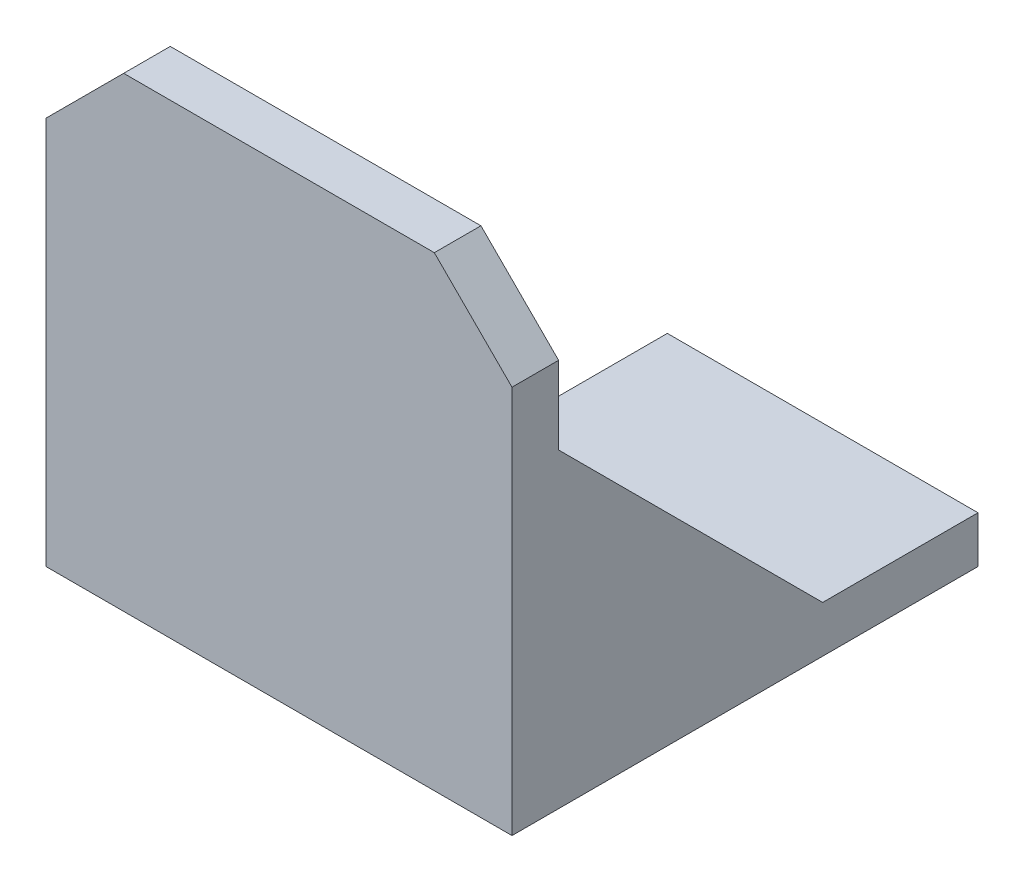
ISO-10303-21;
HEADER;
FILE_DESCRIPTION(('STEP AP214'),'2;1');
FILE_NAME('part.step','',(''),(''),'','','');
FILE_SCHEMA(('AUTOMOTIVE_DESIGN { 1 0 10303 214 1 1 1 1 }'));
ENDSEC;
DATA;
#1=APPLICATION_CONTEXT('core data for automotive mechanical design processes');
#2=APPLICATION_PROTOCOL_DEFINITION('international standard','automotive_design',2000,#1);
#3=PRODUCT_CONTEXT('',#1,'mechanical');
#4=PRODUCT('Part','Part','',(#3));
#5=PRODUCT_RELATED_PRODUCT_CATEGORY('part','',(#4));
#6=PRODUCT_DEFINITION_FORMATION('','',#4);
#7=PRODUCT_DEFINITION_CONTEXT('part definition',#1,'design');
#8=PRODUCT_DEFINITION('design','',#6,#7);
#9=PRODUCT_DEFINITION_SHAPE('','',#8);
#10=(LENGTH_UNIT() NAMED_UNIT(*) SI_UNIT(.MILLI.,.METRE.));
#11=(NAMED_UNIT(*) PLANE_ANGLE_UNIT() SI_UNIT($,.RADIAN.));
#12=(NAMED_UNIT(*) SI_UNIT($,.STERADIAN.) SOLID_ANGLE_UNIT());
#13=UNCERTAINTY_MEASURE_WITH_UNIT(LENGTH_MEASURE(1.E-05),#10,'distance_accuracy_value','');
#14=(GEOMETRIC_REPRESENTATION_CONTEXT(3) GLOBAL_UNCERTAINTY_ASSIGNED_CONTEXT((#13)) GLOBAL_UNIT_ASSIGNED_CONTEXT((#10,
#11,#12)) REPRESENTATION_CONTEXT('',''));
#15=CARTESIAN_POINT('',(0.,0.,0.));
#16=DIRECTION('',(0.,0.,1.));
#17=DIRECTION('',(1.,0.,0.));
#18=AXIS2_PLACEMENT_3D('',#15,#16,#17);
#19=CARTESIAN_POINT('',(0.,3.,0.));
#20=DIRECTION('',(0.,1.,0.));
#21=DIRECTION('',(0.,0.,1.));
#22=AXIS2_PLACEMENT_3D('',#19,#20,#21);
#23=PLANE('',#22);
#24=DIRECTION('',(0.,0.,1.));
#25=VECTOR('',#24,1.);
#26=CARTESIAN_POINT('',(-13.,3.,12.));
#27=LINE('',#26,#25);
#28=CARTESIAN_POINT('',(-13.,3.,-5.));
#29=VERTEX_POINT('',#28);
#30=CARTESIAN_POINT('',(-13.,3.,9.00000000000001));
#31=VERTEX_POINT('',#30);
#32=EDGE_CURVE('E145',#29,#31,#27,.T.);
#33=ORIENTED_EDGE('',*,*,#32,.T.);
#34=DIRECTION('',(-1.,0.,0.));
#35=VECTOR('',#34,1.);
#36=CARTESIAN_POINT('',(0.,3.,9.00000000000001));
#37=LINE('',#36,#35);
#38=CARTESIAN_POINT('',(13.,3.,9.00000000000001));
#39=VERTEX_POINT('',#38);
#40=EDGE_CURVE('E41',#31,#39,#37,.F.);
#41=ORIENTED_EDGE('',*,*,#40,.T.);
#42=DIRECTION('',(0.,0.,-1.));
#43=VECTOR('',#42,1.);
#44=CARTESIAN_POINT('',(13.,3.,-5.));
#45=LINE('',#44,#43);
#46=CARTESIAN_POINT('',(13.,3.,-5.));
#47=VERTEX_POINT('',#46);
#48=EDGE_CURVE('E265',#39,#47,#45,.T.);
#49=ORIENTED_EDGE('',*,*,#48,.T.);
#50=DIRECTION('',(1.,0.,0.));
#51=VECTOR('',#50,1.);
#52=CARTESIAN_POINT('',(13.,3.,-5.));
#53=LINE('',#52,#51);
#54=CARTESIAN_POINT('',(15.,3.,-5.));
#55=VERTEX_POINT('',#54);
#56=EDGE_CURVE('E272',#47,#55,#53,.T.);
#57=ORIENTED_EDGE('',*,*,#56,.T.);
#58=DIRECTION('',(0.,0.,-1.));
#59=VECTOR('',#58,1.);
#60=CARTESIAN_POINT('',(15.,3.,-15.));
#61=LINE('',#60,#59);
#62=CARTESIAN_POINT('',(15.,3.,-15.));
#63=VERTEX_POINT('',#62);
#64=EDGE_CURVE('E174',#55,#63,#61,.T.);
#65=ORIENTED_EDGE('',*,*,#64,.T.);
#66=DIRECTION('',(-1.,0.,0.));
#67=VECTOR('',#66,1.);
#68=CARTESIAN_POINT('',(-4.99999999999999,3.,-15.));
#69=LINE('',#68,#67);
#70=CARTESIAN_POINT('',(-4.99999999999999,3.,-15.));
#71=VERTEX_POINT('',#70);
#72=EDGE_CURVE('E176',#63,#71,#69,.T.);
#73=ORIENTED_EDGE('',*,*,#72,.T.);
#74=DIRECTION('',(0.,0.,1.));
#75=VECTOR('',#74,1.);
#76=CARTESIAN_POINT('',(-4.99999999999999,3.,-15.));
#77=LINE('',#76,#75);
#78=CARTESIAN_POINT('',(-4.99999999999999,3.,-5.));
#79=VERTEX_POINT('',#78);
#80=EDGE_CURVE('E179',#71,#79,#77,.T.);
#81=ORIENTED_EDGE('',*,*,#80,.T.);
#82=DIRECTION('',(-1.,0.,0.));
#83=VECTOR('',#82,1.);
#84=CARTESIAN_POINT('',(-15.,3.,-5.));
#85=LINE('',#84,#83);
#86=EDGE_CURVE('E181',#79,#29,#85,.T.);
#87=ORIENTED_EDGE('',*,*,#86,.T.);
#88=EDGE_LOOP('',(#33,#41,#49,#57,#65,#73,#81,#87));
#89=FACE_BOUND('',#88,.T.);
#90=ADVANCED_FACE('F33',(#89),#23,.T.);
#91=CARTESIAN_POINT('',(15.,3.,-15.));
#92=DIRECTION('',(-1.,0.,0.));
#93=DIRECTION('',(0.,0.,1.));
#94=AXIS2_PLACEMENT_3D('',#91,#92,#93);
#95=PLANE('',#94);
#96=DIRECTION('',(0.,-1.,0.));
#97=VECTOR('',#96,1.);
#98=CARTESIAN_POINT('',(15.,30.,12.));
#99=LINE('',#98,#97);
#100=CARTESIAN_POINT('',(15.,25.,12.));
#101=VERTEX_POINT('',#100);
#102=CARTESIAN_POINT('',(15.,20.0000000000001,12.));
#103=VERTEX_POINT('',#102);
#104=EDGE_CURVE('E171',#101,#103,#99,.T.);
#105=ORIENTED_EDGE('',*,*,#104,.F.);
#106=DIRECTION('',(0.,0.,1.));
#107=VECTOR('',#106,1.);
#108=CARTESIAN_POINT('',(15.,25.,-15.));
#109=LINE('',#108,#107);
#110=CARTESIAN_POINT('',(15.,25.,15.));
#111=VERTEX_POINT('',#110);
#112=EDGE_CURVE('E223',#101,#111,#109,.T.);
#113=ORIENTED_EDGE('',*,*,#112,.T.);
#114=DIRECTION('',(0.,-1.,0.));
#115=VECTOR('',#114,1.);
#116=CARTESIAN_POINT('',(15.,3.,15.));
#117=LINE('',#116,#115);
#118=CARTESIAN_POINT('',(15.,0.,15.));
#119=VERTEX_POINT('',#118);
#120=EDGE_CURVE('E184',#111,#119,#117,.T.);
#121=ORIENTED_EDGE('',*,*,#120,.T.);
#122=DIRECTION('',(0.,0.,-1.));
#123=VECTOR('',#122,1.);
#124=CARTESIAN_POINT('',(15.,0.,-15.));
#125=LINE('',#124,#123);
#126=CARTESIAN_POINT('',(15.,0.,-15.));
#127=VERTEX_POINT('',#126);
#128=EDGE_CURVE('E173',#119,#127,#125,.T.);
#129=ORIENTED_EDGE('',*,*,#128,.T.);
#130=DIRECTION('',(0.,-1.,0.));
#131=VECTOR('',#130,1.);
#132=CARTESIAN_POINT('',(15.,3.,-15.));
#133=LINE('',#132,#131);
#134=EDGE_CURVE('E210',#63,#127,#133,.T.);
#135=ORIENTED_EDGE('',*,*,#134,.F.);
#136=ORIENTED_EDGE('',*,*,#64,.F.);
#137=DIRECTION('',(0.,0.707106781186549,0.707106781186546));
#138=VECTOR('',#137,1.);
#139=CARTESIAN_POINT('',(15.,20.0000000000001,12.));
#140=LINE('',#139,#138);
#141=EDGE_CURVE('E259',#55,#103,#140,.T.);
#142=ORIENTED_EDGE('',*,*,#141,.T.);
#143=EDGE_LOOP('',(#105,#113,#121,#129,#135,#136,#142));
#144=FACE_BOUND('',#143,.T.);
#145=ADVANCED_FACE('F256',(#144),#95,.F.);
#146=CARTESIAN_POINT('',(-4.99999999999999,3.,-15.));
#147=DIRECTION('',(0.,0.,1.));
#148=DIRECTION('',(1.,0.,0.));
#149=AXIS2_PLACEMENT_3D('',#146,#147,#148);
#150=PLANE('',#149);
#151=DIRECTION('',(-1.,0.,0.));
#152=VECTOR('',#151,1.);
#153=CARTESIAN_POINT('',(-4.99999999999999,0.,-15.));
#154=LINE('',#153,#152);
#155=CARTESIAN_POINT('',(-4.99999999999999,0.,-15.));
#156=VERTEX_POINT('',#155);
#157=EDGE_CURVE('E187',#127,#156,#154,.T.);
#158=ORIENTED_EDGE('',*,*,#157,.T.);
#159=DIRECTION('',(0.,-1.,0.));
#160=VECTOR('',#159,1.);
#161=CARTESIAN_POINT('',(-4.99999999999999,3.,-15.));
#162=LINE('',#161,#160);
#163=EDGE_CURVE('E207',#71,#156,#162,.T.);
#164=ORIENTED_EDGE('',*,*,#163,.F.);
#165=ORIENTED_EDGE('',*,*,#72,.F.);
#166=ORIENTED_EDGE('',*,*,#134,.T.);
#167=EDGE_LOOP('',(#158,#164,#165,#166));
#168=FACE_BOUND('',#167,.T.);
#169=ADVANCED_FACE('F285',(#168),#150,.F.);
#170=CARTESIAN_POINT('',(-4.99999999999999,3.,-15.));
#171=DIRECTION('',(1.,0.,0.));
#172=DIRECTION('',(0.,0.,-1.));
#173=AXIS2_PLACEMENT_3D('',#170,#171,#172);
#174=PLANE('',#173);
#175=DIRECTION('',(0.,0.,1.));
#176=VECTOR('',#175,1.);
#177=CARTESIAN_POINT('',(-4.99999999999999,0.,-15.));
#178=LINE('',#177,#176);
#179=CARTESIAN_POINT('',(-4.99999999999999,0.,-5.));
#180=VERTEX_POINT('',#179);
#181=EDGE_CURVE('E189',#156,#180,#178,.T.);
#182=ORIENTED_EDGE('',*,*,#181,.T.);
#183=DIRECTION('',(0.,-1.,0.));
#184=VECTOR('',#183,1.);
#185=CARTESIAN_POINT('',(-4.99999999999999,3.,-5.));
#186=LINE('',#185,#184);
#187=EDGE_CURVE('E204',#79,#180,#186,.T.);
#188=ORIENTED_EDGE('',*,*,#187,.F.);
#189=ORIENTED_EDGE('',*,*,#80,.F.);
#190=ORIENTED_EDGE('',*,*,#163,.T.);
#191=EDGE_LOOP('',(#182,#188,#189,#190));
#192=FACE_BOUND('',#191,.T.);
#193=ADVANCED_FACE('F295',(#192),#174,.F.);
#194=CARTESIAN_POINT('',(-15.,3.,-5.));
#195=DIRECTION('',(0.,0.,1.));
#196=DIRECTION('',(1.,0.,0.));
#197=AXIS2_PLACEMENT_3D('',#194,#195,#196);
#198=PLANE('',#197);
#199=DIRECTION('',(-1.,0.,0.));
#200=VECTOR('',#199,1.);
#201=CARTESIAN_POINT('',(-15.,0.,-5.));
#202=LINE('',#201,#200);
#203=CARTESIAN_POINT('',(-15.,0.,-5.));
#204=VERTEX_POINT('',#203);
#205=EDGE_CURVE('E191',#180,#204,#202,.T.);
#206=ORIENTED_EDGE('',*,*,#205,.T.);
#207=DIRECTION('',(0.,-1.,0.));
#208=VECTOR('',#207,1.);
#209=CARTESIAN_POINT('',(-15.,3.,-5.));
#210=LINE('',#209,#208);
#211=CARTESIAN_POINT('',(-15.,3.,-5.));
#212=VERTEX_POINT('',#211);
#213=EDGE_CURVE('E201',#212,#204,#210,.T.);
#214=ORIENTED_EDGE('',*,*,#213,.F.);
#215=DIRECTION('',(-1.,0.,0.));
#216=VECTOR('',#215,1.);
#217=CARTESIAN_POINT('',(-13.,3.,-5.));
#218=LINE('',#217,#216);
#219=EDGE_CURVE('E154',#29,#212,#218,.T.);
#220=ORIENTED_EDGE('',*,*,#219,.F.);
#221=ORIENTED_EDGE('',*,*,#86,.F.);
#222=ORIENTED_EDGE('',*,*,#187,.T.);
#223=EDGE_LOOP('',(#206,#214,#220,#221,#222));
#224=FACE_BOUND('',#223,.T.);
#225=ADVANCED_FACE('F298',(#224),#198,.F.);
#226=CARTESIAN_POINT('',(-15.,3.,-5.));
#227=DIRECTION('',(1.,0.,0.));
#228=DIRECTION('',(0.,0.,-1.));
#229=AXIS2_PLACEMENT_3D('',#226,#227,#228);
#230=PLANE('',#229);
#231=DIRECTION('',(0.,-1.,0.));
#232=VECTOR('',#231,1.);
#233=CARTESIAN_POINT('',(-15.,3.,15.));
#234=LINE('',#233,#232);
#235=CARTESIAN_POINT('',(-15.,25.,15.));
#236=VERTEX_POINT('',#235);
#237=CARTESIAN_POINT('',(-15.,0.,15.));
#238=VERTEX_POINT('',#237);
#239=EDGE_CURVE('E199',#236,#238,#234,.T.);
#240=ORIENTED_EDGE('',*,*,#239,.F.);
#241=DIRECTION('',(0.,0.,-1.));
#242=VECTOR('',#241,1.);
#243=CARTESIAN_POINT('',(-15.,25.,-5.));
#244=LINE('',#243,#242);
#245=CARTESIAN_POINT('',(-15.,25.,12.));
#246=VERTEX_POINT('',#245);
#247=EDGE_CURVE('E229',#236,#246,#244,.T.);
#248=ORIENTED_EDGE('',*,*,#247,.T.);
#249=DIRECTION('',(0.,-1.,0.));
#250=VECTOR('',#249,1.);
#251=CARTESIAN_POINT('',(-15.,30.,12.));
#252=LINE('',#251,#250);
#253=CARTESIAN_POINT('',(-15.,20.0000000000001,12.));
#254=VERTEX_POINT('',#253);
#255=EDGE_CURVE('E169',#246,#254,#252,.T.);
#256=ORIENTED_EDGE('',*,*,#255,.T.);
#257=DIRECTION('',(0.,-0.707106781186549,-0.707106781186546));
#258=VECTOR('',#257,1.);
#259=CARTESIAN_POINT('',(-15.,3.,-5.));
#260=LINE('',#259,#258);
#261=EDGE_CURVE('E153',#254,#212,#260,.T.);
#262=ORIENTED_EDGE('',*,*,#261,.T.);
#263=ORIENTED_EDGE('',*,*,#213,.T.);
#264=DIRECTION('',(0.,0.,1.));
#265=VECTOR('',#264,1.);
#266=CARTESIAN_POINT('',(-15.,0.,-5.));
#267=LINE('',#266,#265);
#268=EDGE_CURVE('E193',#204,#238,#267,.T.);
#269=ORIENTED_EDGE('',*,*,#268,.T.);
#270=EDGE_LOOP('',(#240,#248,#256,#262,#263,#269));
#271=FACE_BOUND('',#270,.T.);
#272=ADVANCED_FACE('F235',(#271),#230,.F.);
#273=CARTESIAN_POINT('',(-15.,3.,15.));
#274=DIRECTION('',(0.,0.,-1.));
#275=DIRECTION('',(-1.,0.,0.));
#276=AXIS2_PLACEMENT_3D('',#273,#274,#275);
#277=PLANE('',#276);
#278=ORIENTED_EDGE('',*,*,#120,.F.);
#279=DIRECTION('',(0.707106781186546,-0.707106781186549,0.));
#280=VECTOR('',#279,1.);
#281=CARTESIAN_POINT('',(10.,30.,15.));
#282=LINE('',#281,#280);
#283=CARTESIAN_POINT('',(10.,30.,15.));
#284=VERTEX_POINT('',#283);
#285=EDGE_CURVE('E227',#111,#284,#282,.F.);
#286=ORIENTED_EDGE('',*,*,#285,.T.);
#287=DIRECTION('',(1.,0.,0.));
#288=VECTOR('',#287,1.);
#289=CARTESIAN_POINT('',(-15.,30.,15.));
#290=LINE('',#289,#288);
#291=CARTESIAN_POINT('',(-9.99999999999999,30.,15.));
#292=VERTEX_POINT('',#291);
#293=EDGE_CURVE('E162',#292,#284,#290,.T.);
#294=ORIENTED_EDGE('',*,*,#293,.F.);
#295=DIRECTION('',(0.707106781186546,0.707106781186549,0.));
#296=VECTOR('',#295,1.);
#297=CARTESIAN_POINT('',(-9.99999999999999,30.,15.));
#298=LINE('',#297,#296);
#299=EDGE_CURVE('E225',#292,#236,#298,.F.);
#300=ORIENTED_EDGE('',*,*,#299,.T.);
#301=ORIENTED_EDGE('',*,*,#239,.T.);
#302=DIRECTION('',(1.,0.,0.));
#303=VECTOR('',#302,1.);
#304=CARTESIAN_POINT('',(-15.,0.,15.));
#305=LINE('',#304,#303);
#306=EDGE_CURVE('E177',#238,#119,#305,.T.);
#307=ORIENTED_EDGE('',*,*,#306,.T.);
#308=EDGE_LOOP('',(#278,#286,#294,#300,#301,#307));
#309=FACE_BOUND('',#308,.T.);
#310=ADVANCED_FACE('F247',(#309),#277,.F.);
#311=CARTESIAN_POINT('',(0.,0.,0.));
#312=DIRECTION('',(0.,1.,0.));
#313=DIRECTION('',(0.,0.,1.));
#314=AXIS2_PLACEMENT_3D('',#311,#312,#313);
#315=PLANE('',#314);
#316=ORIENTED_EDGE('',*,*,#128,.F.);
#317=ORIENTED_EDGE('',*,*,#306,.F.);
#318=ORIENTED_EDGE('',*,*,#268,.F.);
#319=ORIENTED_EDGE('',*,*,#205,.F.);
#320=ORIENTED_EDGE('',*,*,#181,.F.);
#321=ORIENTED_EDGE('',*,*,#157,.F.);
#322=EDGE_LOOP('',(#316,#317,#318,#319,#320,#321));
#323=FACE_BOUND('',#322,.T.);
#324=ADVANCED_FACE('F290',(#323),#315,.F.);
#325=CARTESIAN_POINT('',(-15.,30.,12.));
#326=DIRECTION('',(0.,0.,1.));
#327=DIRECTION('',(1.,0.,0.));
#328=AXIS2_PLACEMENT_3D('',#325,#326,#327);
#329=PLANE('',#328);
#330=DIRECTION('',(0.,-1.,0.));
#331=VECTOR('',#330,1.);
#332=CARTESIAN_POINT('',(13.,3.,12.));
#333=LINE('',#332,#331);
#334=CARTESIAN_POINT('',(13.,20.0000000000001,12.));
#335=VERTEX_POINT('',#334);
#336=CARTESIAN_POINT('',(13.,6.,12.));
#337=VERTEX_POINT('',#336);
#338=EDGE_CURVE('E263',#335,#337,#333,.T.);
#339=ORIENTED_EDGE('',*,*,#338,.T.);
#340=DIRECTION('',(-1.,0.,0.));
#341=VECTOR('',#340,1.);
#342=CARTESIAN_POINT('',(-15.,6.,12.));
#343=LINE('',#342,#341);
#344=CARTESIAN_POINT('',(-13.,6.,12.));
#345=VERTEX_POINT('',#344);
#346=EDGE_CURVE('E142',#337,#345,#343,.T.);
#347=ORIENTED_EDGE('',*,*,#346,.T.);
#348=DIRECTION('',(0.,1.,0.));
#349=VECTOR('',#348,1.);
#350=CARTESIAN_POINT('',(-13.,20.0000000000001,12.));
#351=LINE('',#350,#349);
#352=CARTESIAN_POINT('',(-13.,20.0000000000001,12.));
#353=VERTEX_POINT('',#352);
#354=EDGE_CURVE('E135',#345,#353,#351,.T.);
#355=ORIENTED_EDGE('',*,*,#354,.T.);
#356=DIRECTION('',(-1.,0.,0.));
#357=VECTOR('',#356,1.);
#358=CARTESIAN_POINT('',(-13.,20.0000000000001,12.));
#359=LINE('',#358,#357);
#360=EDGE_CURVE('E140',#353,#254,#359,.T.);
#361=ORIENTED_EDGE('',*,*,#360,.T.);
#362=ORIENTED_EDGE('',*,*,#255,.F.);
#363=DIRECTION('',(-0.707106781186546,-0.707106781186549,0.));
#364=VECTOR('',#363,1.);
#365=CARTESIAN_POINT('',(-9.99999999999999,30.,12.));
#366=LINE('',#365,#364);
#367=CARTESIAN_POINT('',(-9.99999999999999,30.,12.));
#368=VERTEX_POINT('',#367);
#369=EDGE_CURVE('E219',#246,#368,#366,.F.);
#370=ORIENTED_EDGE('',*,*,#369,.T.);
#371=DIRECTION('',(-1.,0.,0.));
#372=VECTOR('',#371,1.);
#373=CARTESIAN_POINT('',(-15.,30.,12.));
#374=LINE('',#373,#372);
#375=CARTESIAN_POINT('',(10.,30.,12.));
#376=VERTEX_POINT('',#375);
#377=EDGE_CURVE('E166',#376,#368,#374,.T.);
#378=ORIENTED_EDGE('',*,*,#377,.F.);
#379=DIRECTION('',(-0.707106781186546,0.707106781186549,0.));
#380=VECTOR('',#379,1.);
#381=CARTESIAN_POINT('',(10.,30.,12.));
#382=LINE('',#381,#380);
#383=EDGE_CURVE('E221',#376,#101,#382,.F.);
#384=ORIENTED_EDGE('',*,*,#383,.T.);
#385=ORIENTED_EDGE('',*,*,#104,.T.);
#386=DIRECTION('',(1.,0.,0.));
#387=VECTOR('',#386,1.);
#388=CARTESIAN_POINT('',(13.,20.0000000000001,12.));
#389=LINE('',#388,#387);
#390=EDGE_CURVE('E161',#335,#103,#389,.T.);
#391=ORIENTED_EDGE('',*,*,#390,.F.);
#392=EDGE_LOOP('',(#339,#347,#355,#361,#362,#370,#378,#384,#385,#391));
#393=FACE_BOUND('',#392,.T.);
#394=ADVANCED_FACE('F138',(#393),#329,.F.);
#395=CARTESIAN_POINT('',(0.,30.,0.));
#396=DIRECTION('',(0.,-1.,0.));
#397=DIRECTION('',(0.,0.,-1.));
#398=AXIS2_PLACEMENT_3D('',#395,#396,#397);
#399=PLANE('',#398);
#400=ORIENTED_EDGE('',*,*,#293,.T.);
#401=DIRECTION('',(0.,0.,-1.));
#402=VECTOR('',#401,1.);
#403=CARTESIAN_POINT('',(10.,30.,0.));
#404=LINE('',#403,#402);
#405=EDGE_CURVE('E216',#284,#376,#404,.T.);
#406=ORIENTED_EDGE('',*,*,#405,.T.);
#407=ORIENTED_EDGE('',*,*,#377,.T.);
#408=DIRECTION('',(0.,0.,1.));
#409=VECTOR('',#408,1.);
#410=CARTESIAN_POINT('',(-9.99999999999999,30.,0.));
#411=LINE('',#410,#409);
#412=EDGE_CURVE('E213',#368,#292,#411,.T.);
#413=ORIENTED_EDGE('',*,*,#412,.T.);
#414=EDGE_LOOP('',(#400,#406,#407,#413));
#415=FACE_BOUND('',#414,.T.);
#416=ADVANCED_FACE('F243',(#415),#399,.F.);
#417=CARTESIAN_POINT('',(-13.,3.,-5.));
#418=DIRECTION('',(0.,0.707106781186546,-0.707106781186549));
#419=DIRECTION('',(0.,0.707106781186549,0.707106781186546));
#420=AXIS2_PLACEMENT_3D('',#417,#418,#419);
#421=PLANE('',#420);
#422=ORIENTED_EDGE('',*,*,#261,.F.);
#423=ORIENTED_EDGE('',*,*,#360,.F.);
#424=DIRECTION('',(0.,-0.707106781186549,-0.707106781186546));
#425=VECTOR('',#424,1.);
#426=CARTESIAN_POINT('',(-13.,3.,-5.));
#427=LINE('',#426,#425);
#428=EDGE_CURVE('E144',#353,#29,#427,.T.);
#429=ORIENTED_EDGE('',*,*,#428,.T.);
#430=ORIENTED_EDGE('',*,*,#219,.T.);
#431=EDGE_LOOP('',(#422,#423,#429,#430));
#432=FACE_BOUND('',#431,.T.);
#433=ADVANCED_FACE('F150',(#432),#421,.T.);
#434=CARTESIAN_POINT('',(-13.,0.,0.));
#435=DIRECTION('',(-1.,0.,0.));
#436=DIRECTION('',(0.,0.,1.));
#437=AXIS2_PLACEMENT_3D('',#434,#435,#436);
#438=PLANE('',#437);
#439=ORIENTED_EDGE('',*,*,#354,.F.);
#440=CARTESIAN_POINT('',(-13.,6.,9.00000000000001));
#441=DIRECTION('',(-1.,0.,0.));
#442=DIRECTION('',(0.,0.,1.));
#443=AXIS2_PLACEMENT_3D('',#440,#441,#442);
#444=CIRCLE('',#443,3.);
#445=EDGE_CURVE('E55',#345,#31,#444,.F.);
#446=ORIENTED_EDGE('',*,*,#445,.T.);
#447=ORIENTED_EDGE('',*,*,#32,.F.);
#448=ORIENTED_EDGE('',*,*,#428,.F.);
#449=EDGE_LOOP('',(#439,#446,#447,#448));
#450=FACE_BOUND('',#449,.T.);
#451=ADVANCED_FACE('F156',(#450),#438,.F.);
#452=CARTESIAN_POINT('',(13.,20.0000000000001,12.));
#453=DIRECTION('',(0.,0.707106781186546,-0.707106781186549));
#454=DIRECTION('',(0.,0.707106781186549,0.707106781186546));
#455=AXIS2_PLACEMENT_3D('',#452,#453,#454);
#456=PLANE('',#455);
#457=ORIENTED_EDGE('',*,*,#141,.F.);
#458=ORIENTED_EDGE('',*,*,#56,.F.);
#459=DIRECTION('',(0.,0.707106781186549,0.707106781186546));
#460=VECTOR('',#459,1.);
#461=CARTESIAN_POINT('',(13.,20.0000000000001,12.));
#462=LINE('',#461,#460);
#463=EDGE_CURVE('E269',#47,#335,#462,.T.);
#464=ORIENTED_EDGE('',*,*,#463,.T.);
#465=ORIENTED_EDGE('',*,*,#390,.T.);
#466=EDGE_LOOP('',(#457,#458,#464,#465));
#467=FACE_BOUND('',#466,.T.);
#468=ADVANCED_FACE('F281',(#467),#456,.T.);
#469=CARTESIAN_POINT('',(13.,0.,0.));
#470=DIRECTION('',(1.,0.,0.));
#471=DIRECTION('',(0.,0.,-1.));
#472=AXIS2_PLACEMENT_3D('',#469,#470,#471);
#473=PLANE('',#472);
#474=ORIENTED_EDGE('',*,*,#48,.F.);
#475=CARTESIAN_POINT('',(13.,6.,9.00000000000001));
#476=DIRECTION('',(1.,0.,0.));
#477=DIRECTION('',(0.,0.,-1.));
#478=AXIS2_PLACEMENT_3D('',#475,#476,#477);
#479=CIRCLE('',#478,3.);
#480=EDGE_CURVE('E11',#39,#337,#479,.F.);
#481=ORIENTED_EDGE('',*,*,#480,.T.);
#482=ORIENTED_EDGE('',*,*,#338,.F.);
#483=ORIENTED_EDGE('',*,*,#463,.F.);
#484=EDGE_LOOP('',(#474,#481,#482,#483));
#485=FACE_BOUND('',#484,.T.);
#486=ADVANCED_FACE('F278',(#485),#473,.F.);
#487=CARTESIAN_POINT('',(10.,30.,0.));
#488=DIRECTION('',(-0.707106781186549,-0.707106781186546,0.));
#489=DIRECTION('',(0.,0.,-1.));
#490=AXIS2_PLACEMENT_3D('',#487,#488,#489);
#491=PLANE('',#490);
#492=ORIENTED_EDGE('',*,*,#285,.F.);
#493=ORIENTED_EDGE('',*,*,#112,.F.);
#494=ORIENTED_EDGE('',*,*,#383,.F.);
#495=ORIENTED_EDGE('',*,*,#405,.F.);
#496=EDGE_LOOP('',(#492,#493,#494,#495));
#497=FACE_BOUND('',#496,.T.);
#498=ADVANCED_FACE('F251',(#497),#491,.F.);
#499=CARTESIAN_POINT('',(-9.99999999999999,30.,0.));
#500=DIRECTION('',(0.707106781186549,-0.707106781186546,0.));
#501=DIRECTION('',(0.,0.,1.));
#502=AXIS2_PLACEMENT_3D('',#499,#500,#501);
#503=PLANE('',#502);
#504=ORIENTED_EDGE('',*,*,#369,.F.);
#505=ORIENTED_EDGE('',*,*,#247,.F.);
#506=ORIENTED_EDGE('',*,*,#299,.F.);
#507=ORIENTED_EDGE('',*,*,#412,.F.);
#508=EDGE_LOOP('',(#504,#505,#506,#507));
#509=FACE_BOUND('',#508,.T.);
#510=ADVANCED_FACE('F240',(#509),#503,.F.);
#511=CARTESIAN_POINT('',(-15.,6.,9.00000000000001));
#512=DIRECTION('',(-1.,0.,0.));
#513=DIRECTION('',(0.,0.,1.));
#514=AXIS2_PLACEMENT_3D('',#511,#512,#513);
#515=CYLINDRICAL_SURFACE('',#514,3.);
#516=ORIENTED_EDGE('',*,*,#480,.F.);
#517=ORIENTED_EDGE('',*,*,#40,.F.);
#518=ORIENTED_EDGE('',*,*,#445,.F.);
#519=ORIENTED_EDGE('',*,*,#346,.F.);
#520=EDGE_LOOP('',(#516,#517,#518,#519));
#521=FACE_BOUND('',#520,.T.);
#522=ADVANCED_FACE('F35',(#521),#515,.F.);
#523=CLOSED_SHELL('',(#90,#145,#169,#193,#225,#272,#310,#324,#394,#416,#433,#451,#468,#486,#498,
#510,#522));
#524=MANIFOLD_SOLID_BREP('B2',#523);
#525=ADVANCED_BREP_SHAPE_REPRESENTATION('',(#18,#524),#14);
#526=SHAPE_DEFINITION_REPRESENTATION(#9,#525);
ENDSEC;
END-ISO-10303-21;
